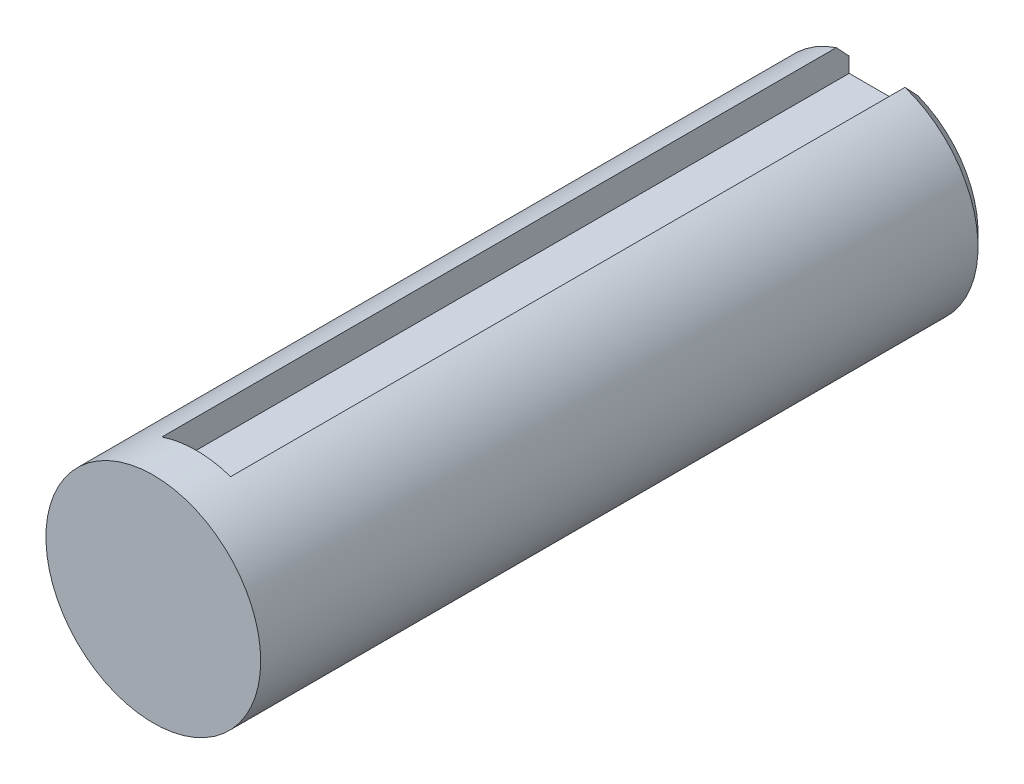
ISO-10303-21;
HEADER;
FILE_DESCRIPTION(('STEP AP214'),'2;1');
FILE_NAME('part.step','',(''),(''),'','','');
FILE_SCHEMA(('AUTOMOTIVE_DESIGN { 1 0 10303 214 1 1 1 1 }'));
ENDSEC;
DATA;
#1=APPLICATION_CONTEXT('core data for automotive mechanical design processes');
#2=APPLICATION_PROTOCOL_DEFINITION('international standard','automotive_design',2000,#1);
#3=PRODUCT_CONTEXT('',#1,'mechanical');
#4=PRODUCT('Part','Part','',(#3));
#5=PRODUCT_RELATED_PRODUCT_CATEGORY('part','',(#4));
#6=PRODUCT_DEFINITION_FORMATION('','',#4);
#7=PRODUCT_DEFINITION_CONTEXT('part definition',#1,'design');
#8=PRODUCT_DEFINITION('design','',#6,#7);
#9=PRODUCT_DEFINITION_SHAPE('','',#8);
#10=(LENGTH_UNIT() NAMED_UNIT(*) SI_UNIT(.MILLI.,.METRE.));
#11=(NAMED_UNIT(*) PLANE_ANGLE_UNIT() SI_UNIT($,.RADIAN.));
#12=(NAMED_UNIT(*) SI_UNIT($,.STERADIAN.) SOLID_ANGLE_UNIT());
#13=UNCERTAINTY_MEASURE_WITH_UNIT(LENGTH_MEASURE(1.E-05),#10,'distance_accuracy_value','');
#14=(GEOMETRIC_REPRESENTATION_CONTEXT(3) GLOBAL_UNCERTAINTY_ASSIGNED_CONTEXT((#13)) GLOBAL_UNIT_ASSIGNED_CONTEXT((#10,
#11,#12)) REPRESENTATION_CONTEXT('',''));
#15=CARTESIAN_POINT('',(0.,0.,0.));
#16=DIRECTION('',(0.,0.,1.));
#17=DIRECTION('',(1.,0.,0.));
#18=AXIS2_PLACEMENT_3D('',#15,#16,#17);
#19=CARTESIAN_POINT('',(0.,0.,85.));
#20=DIRECTION('',(0.,0.,-1.));
#21=DIRECTION('',(-1.,0.,0.));
#22=AXIS2_PLACEMENT_3D('',#19,#20,#21);
#23=CYLINDRICAL_SURFACE('',#22,12.5);
#24=CARTESIAN_POINT('',(0.,0.,85.));
#25=DIRECTION('',(0.,0.,1.));
#26=DIRECTION('',(1.,0.,0.));
#27=AXIS2_PLACEMENT_3D('',#24,#25,#26);
#28=CIRCLE('',#27,12.5);
#29=CARTESIAN_POINT('',(12.5,0.,85.));
#30=VERTEX_POINT('',#29);
#31=EDGE_CURVE('E126',#30,#30,#28,.T.);
#32=ORIENTED_EDGE('',*,*,#31,.F.);
#33=EDGE_LOOP('',(#32));
#34=FACE_BOUND('',#33,.T.);
#35=DIRECTION('',(0.,0.,-1.));
#36=VECTOR('',#35,1.);
#37=CARTESIAN_POINT('',(-4.,11.842719282327,85.));
#38=LINE('',#37,#36);
#39=CARTESIAN_POINT('',(-4.,11.842719282327,80.));
#40=VERTEX_POINT('',#39);
#41=CARTESIAN_POINT('',(-4.,11.842719282327,1.5));
#42=VERTEX_POINT('',#41);
#43=EDGE_CURVE('E123',#40,#42,#38,.T.);
#44=ORIENTED_EDGE('',*,*,#43,.T.);
#45=CARTESIAN_POINT('',(0.,0.,1.5));
#46=DIRECTION('',(0.,0.,1.));
#47=DIRECTION('',(1.,0.,0.));
#48=AXIS2_PLACEMENT_3D('',#45,#46,#47);
#49=CIRCLE('',#48,12.5);
#50=CARTESIAN_POINT('',(4.,11.842719282327,1.5));
#51=VERTEX_POINT('',#50);
#52=EDGE_CURVE('E131',#42,#51,#49,.T.);
#53=ORIENTED_EDGE('',*,*,#52,.T.);
#54=DIRECTION('',(0.,0.,-1.));
#55=VECTOR('',#54,1.);
#56=CARTESIAN_POINT('',(4.,11.842719282327,85.));
#57=LINE('',#56,#55);
#58=CARTESIAN_POINT('',(4.,11.842719282327,80.));
#59=VERTEX_POINT('',#58);
#60=EDGE_CURVE('E120',#51,#59,#57,.F.);
#61=ORIENTED_EDGE('',*,*,#60,.T.);
#62=CARTESIAN_POINT('',(0.,0.,80.));
#63=DIRECTION('',(0.,0.,-1.));
#64=DIRECTION('',(-1.,0.,0.));
#65=AXIS2_PLACEMENT_3D('',#62,#63,#64);
#66=CIRCLE('',#65,12.5);
#67=EDGE_CURVE('E99',#40,#59,#66,.T.);
#68=ORIENTED_EDGE('',*,*,#67,.F.);
#69=EDGE_LOOP('',(#44,#53,#61,#68));
#70=FACE_BOUND('',#69,.T.);
#71=ADVANCED_FACE('F38',(#34,#70),#23,.T.);
#72=CARTESIAN_POINT('',(0.,0.,85.));
#73=DIRECTION('',(0.,0.,1.));
#74=DIRECTION('',(1.,0.,0.));
#75=AXIS2_PLACEMENT_3D('',#72,#73,#74);
#76=PLANE('',#75);
#77=ORIENTED_EDGE('',*,*,#31,.T.);
#78=EDGE_LOOP('',(#77));
#79=FACE_BOUND('',#78,.T.);
#80=ADVANCED_FACE('F148',(#79),#76,.T.);
#81=CARTESIAN_POINT('',(0.,0.,0.));
#82=DIRECTION('',(0.,0.,1.));
#83=DIRECTION('',(1.,0.,0.));
#84=AXIS2_PLACEMENT_3D('',#81,#82,#83);
#85=PLANE('',#84);
#86=DIRECTION('',(0.,1.,0.));
#87=VECTOR('',#86,1.);
#88=CARTESIAN_POINT('',(4.,0.,0.));
#89=LINE('',#88,#87);
#90=CARTESIAN_POINT('',(4.,8.5,0.));
#91=VERTEX_POINT('',#90);
#92=CARTESIAN_POINT('',(4.,10.2469507659596,0.));
#93=VERTEX_POINT('',#92);
#94=EDGE_CURVE('E105',#91,#93,#89,.T.);
#95=ORIENTED_EDGE('',*,*,#94,.T.);
#96=CARTESIAN_POINT('',(0.,0.,0.));
#97=DIRECTION('',(0.,0.,1.));
#98=DIRECTION('',(1.,0.,0.));
#99=AXIS2_PLACEMENT_3D('',#96,#97,#98);
#100=CIRCLE('',#99,11.);
#101=CARTESIAN_POINT('',(-4.,10.2469507659596,0.));
#102=VERTEX_POINT('',#101);
#103=EDGE_CURVE('E53',#93,#102,#100,.F.);
#104=ORIENTED_EDGE('',*,*,#103,.T.);
#105=DIRECTION('',(0.,1.,0.));
#106=VECTOR('',#105,1.);
#107=CARTESIAN_POINT('',(-4.,16.5,0.));
#108=LINE('',#107,#106);
#109=CARTESIAN_POINT('',(-4.,8.5,0.));
#110=VERTEX_POINT('',#109);
#111=EDGE_CURVE('E116',#110,#102,#108,.T.);
#112=ORIENTED_EDGE('',*,*,#111,.F.);
#113=DIRECTION('',(-1.,0.,0.));
#114=VECTOR('',#113,1.);
#115=CARTESIAN_POINT('',(4.,8.5,0.));
#116=LINE('',#115,#114);
#117=EDGE_CURVE('E118',#91,#110,#116,.T.);
#118=ORIENTED_EDGE('',*,*,#117,.F.);
#119=EDGE_LOOP('',(#95,#104,#112,#118));
#120=FACE_BOUND('',#119,.T.);
#121=ADVANCED_FACE('F151',(#120),#85,.F.);
#122=CARTESIAN_POINT('',(0.,0.,80.));
#123=DIRECTION('',(0.,0.,-1.));
#124=DIRECTION('',(-1.,0.,0.));
#125=AXIS2_PLACEMENT_3D('',#122,#123,#124);
#126=PLANE('',#125);
#127=ORIENTED_EDGE('',*,*,#67,.T.);
#128=DIRECTION('',(0.,-1.,0.));
#129=VECTOR('',#128,1.);
#130=CARTESIAN_POINT('',(4.,16.5,80.));
#131=LINE('',#130,#129);
#132=CARTESIAN_POINT('',(4.,8.5,80.));
#133=VERTEX_POINT('',#132);
#134=EDGE_CURVE('E92',#59,#133,#131,.T.);
#135=ORIENTED_EDGE('',*,*,#134,.T.);
#136=DIRECTION('',(-1.,0.,0.));
#137=VECTOR('',#136,1.);
#138=CARTESIAN_POINT('',(4.,8.5,80.));
#139=LINE('',#138,#137);
#140=CARTESIAN_POINT('',(-4.,8.5,80.));
#141=VERTEX_POINT('',#140);
#142=EDGE_CURVE('E97',#133,#141,#139,.T.);
#143=ORIENTED_EDGE('',*,*,#142,.T.);
#144=DIRECTION('',(0.,1.,0.));
#145=VECTOR('',#144,1.);
#146=CARTESIAN_POINT('',(-4.,16.5,80.));
#147=LINE('',#146,#145);
#148=EDGE_CURVE('E100',#141,#40,#147,.T.);
#149=ORIENTED_EDGE('',*,*,#148,.T.);
#150=EDGE_LOOP('',(#127,#135,#143,#149));
#151=FACE_BOUND('',#150,.T.);
#152=ADVANCED_FACE('F94',(#151),#126,.T.);
#153=CARTESIAN_POINT('',(-4.,16.5,80.));
#154=DIRECTION('',(-1.,0.,0.));
#155=DIRECTION('',(0.,0.,1.));
#156=AXIS2_PLACEMENT_3D('',#153,#154,#155);
#157=PLANE('',#156);
#158=ORIENTED_EDGE('',*,*,#111,.T.);
#159=CARTESIAN_POINT('',(-4.,10.2469507659596,0.));
#160=CARTESIAN_POINT('',(-4.,10.3804929917297,0.124401517309549));
#161=CARTESIAN_POINT('',(-4.,10.5138762289712,0.248973545521785));
#162=CARTESIAN_POINT('',(-4.,10.7803528254464,0.498426108531669));
#163=CARTESIAN_POINT('',(-4.,10.913446185957,0.623306641965364));
#164=CARTESIAN_POINT('',(-4.,11.1793722017139,0.873344700526162));
#165=CARTESIAN_POINT('',(-4.,11.3122048571653,0.998502225435451));
#166=CARTESIAN_POINT('',(-4.,11.5776336909547,1.24906896753961));
#167=CARTESIAN_POINT('',(-4.,11.7102298682471,1.3744781858422));
#168=CARTESIAN_POINT('',(-4.,11.842719282327,1.5));
#169=B_SPLINE_CURVE_WITH_KNOTS('',3,(#159,#160,#161,#162,#163,#164,#165,#166,#167,#168),
.UNSPECIFIED.,.F.,.F.,(4,2,2,2,4),(0.,0.547524462965537,1.0950465095503,1.64256812574023,
2.19009215694509),.UNSPECIFIED.);
#170=EDGE_CURVE('E11',#102,#42,#169,.T.);
#171=ORIENTED_EDGE('',*,*,#170,.T.);
#172=ORIENTED_EDGE('',*,*,#43,.F.);
#173=ORIENTED_EDGE('',*,*,#148,.F.);
#174=DIRECTION('',(0.,0.,-1.));
#175=VECTOR('',#174,1.);
#176=CARTESIAN_POINT('',(-4.,8.5,80.));
#177=LINE('',#176,#175);
#178=EDGE_CURVE('E109',#141,#110,#177,.T.);
#179=ORIENTED_EDGE('',*,*,#178,.T.);
#180=EDGE_LOOP('',(#158,#171,#172,#173,#179));
#181=FACE_BOUND('',#180,.T.);
#182=ADVANCED_FACE('F142',(#181),#157,.F.);
#183=CARTESIAN_POINT('',(4.,16.5,80.));
#184=DIRECTION('',(1.,0.,0.));
#185=DIRECTION('',(0.,0.,-1.));
#186=AXIS2_PLACEMENT_3D('',#183,#184,#185);
#187=PLANE('',#186);
#188=ORIENTED_EDGE('',*,*,#60,.F.);
#189=CARTESIAN_POINT('',(4.,11.842719282327,1.5));
#190=CARTESIAN_POINT('',(4.,11.7102298682471,1.3744781858422));
#191=CARTESIAN_POINT('',(4.,11.5776336909547,1.24906896753961));
#192=CARTESIAN_POINT('',(4.,11.3122048571653,0.998502225435452));
#193=CARTESIAN_POINT('',(4.,11.1793722017139,0.873344700526162));
#194=CARTESIAN_POINT('',(4.,10.913446185957,0.623306641965365));
#195=CARTESIAN_POINT('',(4.,10.7803528254464,0.49842610853167));
#196=CARTESIAN_POINT('',(4.,10.5138762289712,0.248973545521786));
#197=CARTESIAN_POINT('',(4.,10.3804929917297,0.12440151730955));
#198=CARTESIAN_POINT('',(4.,10.2469507659596,0.));
#199=B_SPLINE_CURVE_WITH_KNOTS('',3,(#189,#190,#191,#192,#193,#194,#195,#196,#197,#198),
.UNSPECIFIED.,.F.,.F.,(4,2,2,2,4),(0.,0.547524031204858,1.09504564739479,1.64256769397955,
2.19009215694509),.UNSPECIFIED.);
#200=EDGE_CURVE('E67',#51,#93,#199,.T.);
#201=ORIENTED_EDGE('',*,*,#200,.T.);
#202=ORIENTED_EDGE('',*,*,#94,.F.);
#203=DIRECTION('',(0.,0.,-1.));
#204=VECTOR('',#203,1.);
#205=CARTESIAN_POINT('',(4.,8.5,80.));
#206=LINE('',#205,#204);
#207=EDGE_CURVE('E103',#133,#91,#206,.T.);
#208=ORIENTED_EDGE('',*,*,#207,.F.);
#209=ORIENTED_EDGE('',*,*,#134,.F.);
#210=EDGE_LOOP('',(#188,#201,#202,#208,#209));
#211=FACE_BOUND('',#210,.T.);
#212=ADVANCED_FACE('F104',(#211),#187,.F.);
#213=CARTESIAN_POINT('',(4.,8.5,80.));
#214=DIRECTION('',(0.,-1.,0.));
#215=DIRECTION('',(0.,0.,-1.));
#216=AXIS2_PLACEMENT_3D('',#213,#214,#215);
#217=PLANE('',#216);
#218=ORIENTED_EDGE('',*,*,#117,.T.);
#219=ORIENTED_EDGE('',*,*,#178,.F.);
#220=ORIENTED_EDGE('',*,*,#142,.F.);
#221=ORIENTED_EDGE('',*,*,#207,.T.);
#222=EDGE_LOOP('',(#218,#219,#220,#221));
#223=FACE_BOUND('',#222,.T.);
#224=ADVANCED_FACE('F111',(#223),#217,.F.);
#225=CARTESIAN_POINT('',(0.,0.,1.5));
#226=DIRECTION('',(0.,0.,1.));
#227=DIRECTION('',(1.,0.,0.));
#228=AXIS2_PLACEMENT_3D('',#225,#226,#227);
#229=CONICAL_SURFACE('',#228,12.5,0.785398163397452);
#230=ORIENTED_EDGE('',*,*,#170,.F.);
#231=ORIENTED_EDGE('',*,*,#103,.F.);
#232=ORIENTED_EDGE('',*,*,#200,.F.);
#233=ORIENTED_EDGE('',*,*,#52,.F.);
#234=EDGE_LOOP('',(#230,#231,#232,#233));
#235=FACE_BOUND('',#234,.T.);
#236=ADVANCED_FACE('F41',(#235),#229,.T.);
#237=CLOSED_SHELL('',(#71,#80,#121,#152,#182,#212,#224,#236));
#238=MANIFOLD_SOLID_BREP('B2',#237);
#239=ADVANCED_BREP_SHAPE_REPRESENTATION('',(#18,#238),#14);
#240=SHAPE_DEFINITION_REPRESENTATION(#9,#239);
ENDSEC;
END-ISO-10303-21;
